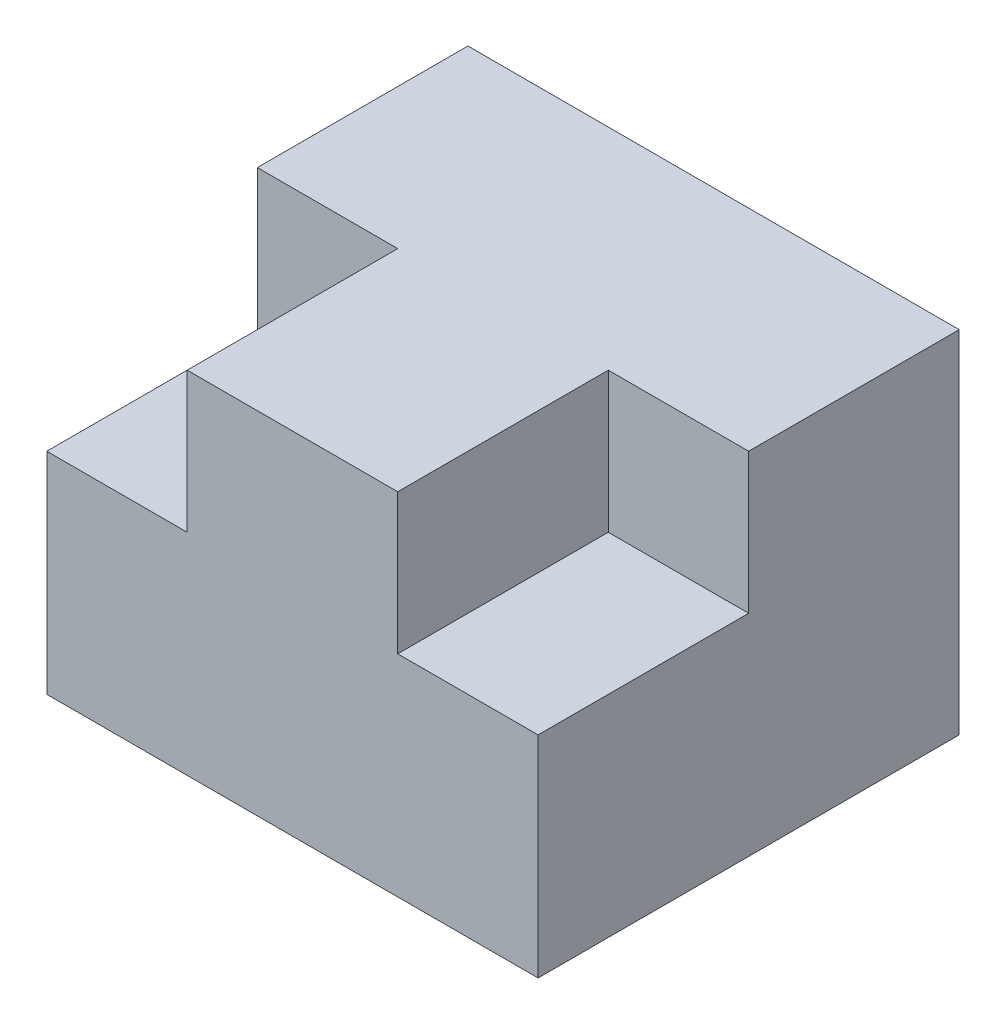
ISO-10303-21;
HEADER;
FILE_DESCRIPTION(('STEP AP214'),'2;1');
FILE_NAME('part.step','',(''),(''),'','','');
FILE_SCHEMA(('AUTOMOTIVE_DESIGN { 1 0 10303 214 1 1 1 1 }'));
ENDSEC;
DATA;
#1=APPLICATION_CONTEXT('core data for automotive mechanical design processes');
#2=APPLICATION_PROTOCOL_DEFINITION('international standard','automotive_design',2000,#1);
#3=PRODUCT_CONTEXT('',#1,'mechanical');
#4=PRODUCT('Part','Part','',(#3));
#5=PRODUCT_RELATED_PRODUCT_CATEGORY('part','',(#4));
#6=PRODUCT_DEFINITION_FORMATION('','',#4);
#7=PRODUCT_DEFINITION_CONTEXT('part definition',#1,'design');
#8=PRODUCT_DEFINITION('design','',#6,#7);
#9=PRODUCT_DEFINITION_SHAPE('','',#8);
#10=(LENGTH_UNIT() NAMED_UNIT(*) SI_UNIT(.MILLI.,.METRE.));
#11=(NAMED_UNIT(*) PLANE_ANGLE_UNIT() SI_UNIT($,.RADIAN.));
#12=(NAMED_UNIT(*) SI_UNIT($,.STERADIAN.) SOLID_ANGLE_UNIT());
#13=UNCERTAINTY_MEASURE_WITH_UNIT(LENGTH_MEASURE(1.E-05),#10,'distance_accuracy_value','');
#14=(GEOMETRIC_REPRESENTATION_CONTEXT(3) GLOBAL_UNCERTAINTY_ASSIGNED_CONTEXT((#13)) GLOBAL_UNIT_ASSIGNED_CONTEXT((#10,
#11,#12)) REPRESENTATION_CONTEXT('',''));
#15=CARTESIAN_POINT('',(0.,0.,0.));
#16=DIRECTION('',(0.,0.,1.));
#17=DIRECTION('',(1.,0.,0.));
#18=AXIS2_PLACEMENT_3D('',#15,#16,#17);
#19=CARTESIAN_POINT('',(0.,0.,15.));
#20=DIRECTION('',(0.,0.,1.));
#21=DIRECTION('',(1.,0.,0.));
#22=AXIS2_PLACEMENT_3D('',#19,#20,#21);
#23=PLANE('',#22);
#24=DIRECTION('',(-1.,0.,0.));
#25=VECTOR('',#24,1.);
#26=CARTESIAN_POINT('',(0.,15.,15.));
#27=LINE('',#26,#25);
#28=CARTESIAN_POINT('',(10.,15.,15.));
#29=VERTEX_POINT('',#28);
#30=CARTESIAN_POINT('',(0.,15.,15.));
#31=VERTEX_POINT('',#30);
#32=EDGE_CURVE('E143',#29,#31,#27,.T.);
#33=ORIENTED_EDGE('',*,*,#32,.F.);
#34=DIRECTION('',(0.,1.,0.));
#35=VECTOR('',#34,1.);
#36=CARTESIAN_POINT('',(10.,0.,15.));
#37=LINE('',#36,#35);
#38=CARTESIAN_POINT('',(10.,25.,15.));
#39=VERTEX_POINT('',#38);
#40=EDGE_CURVE('E107',#29,#39,#37,.T.);
#41=ORIENTED_EDGE('',*,*,#40,.T.);
#42=DIRECTION('',(1.,0.,0.));
#43=VECTOR('',#42,1.);
#44=CARTESIAN_POINT('',(0.,25.,15.));
#45=LINE('',#44,#43);
#46=CARTESIAN_POINT('',(0.,25.,15.));
#47=VERTEX_POINT('',#46);
#48=EDGE_CURVE('E126',#47,#39,#45,.T.);
#49=ORIENTED_EDGE('',*,*,#48,.F.);
#50=DIRECTION('',(0.,1.,0.));
#51=VECTOR('',#50,1.);
#52=CARTESIAN_POINT('',(0.,0.,15.));
#53=LINE('',#52,#51);
#54=EDGE_CURVE('E57',#31,#47,#53,.T.);
#55=ORIENTED_EDGE('',*,*,#54,.F.);
#56=EDGE_LOOP('',(#33,#41,#49,#55));
#57=FACE_BOUND('',#56,.T.);
#58=ADVANCED_FACE('F33',(#57),#23,.T.);
#59=CARTESIAN_POINT('',(35.,0.,15.));
#60=DIRECTION('',(-1.,0.,0.));
#61=DIRECTION('',(0.,0.,1.));
#62=AXIS2_PLACEMENT_3D('',#59,#60,#61);
#63=PLANE('',#62);
#64=DIRECTION('',(0.,1.,0.));
#65=VECTOR('',#64,1.);
#66=CARTESIAN_POINT('',(35.,0.,0.));
#67=LINE('',#66,#65);
#68=CARTESIAN_POINT('',(35.,0.,0.));
#69=VERTEX_POINT('',#68);
#70=CARTESIAN_POINT('',(35.,25.,0.));
#71=VERTEX_POINT('',#70);
#72=EDGE_CURVE('E96',#69,#71,#67,.T.);
#73=ORIENTED_EDGE('',*,*,#72,.T.);
#74=DIRECTION('',(0.,0.,-1.));
#75=VECTOR('',#74,1.);
#76=CARTESIAN_POINT('',(35.,25.,15.));
#77=LINE('',#76,#75);
#78=CARTESIAN_POINT('',(35.,25.,15.));
#79=VERTEX_POINT('',#78);
#80=EDGE_CURVE('E11',#79,#71,#77,.T.);
#81=ORIENTED_EDGE('',*,*,#80,.F.);
#82=DIRECTION('',(0.,1.,0.));
#83=VECTOR('',#82,1.);
#84=CARTESIAN_POINT('',(35.,0.,15.));
#85=LINE('',#84,#83);
#86=CARTESIAN_POINT('',(35.,15.,15.));
#87=VERTEX_POINT('',#86);
#88=EDGE_CURVE('E89',#87,#79,#85,.T.);
#89=ORIENTED_EDGE('',*,*,#88,.F.);
#90=DIRECTION('',(0.,0.,-1.));
#91=VECTOR('',#90,1.);
#92=CARTESIAN_POINT('',(35.,15.,30.));
#93=LINE('',#92,#91);
#94=CARTESIAN_POINT('',(35.,15.,30.));
#95=VERTEX_POINT('',#94);
#96=EDGE_CURVE('E48',#95,#87,#93,.T.);
#97=ORIENTED_EDGE('',*,*,#96,.F.);
#98=DIRECTION('',(0.,1.,0.));
#99=VECTOR('',#98,1.);
#100=CARTESIAN_POINT('',(35.,0.,30.));
#101=LINE('',#100,#99);
#102=CARTESIAN_POINT('',(35.,0.,30.));
#103=VERTEX_POINT('',#102);
#104=EDGE_CURVE('E98',#103,#95,#101,.T.);
#105=ORIENTED_EDGE('',*,*,#104,.F.);
#106=DIRECTION('',(0.,0.,-1.));
#107=VECTOR('',#106,1.);
#108=CARTESIAN_POINT('',(35.,0.,15.));
#109=LINE('',#108,#107);
#110=EDGE_CURVE('E82',#103,#69,#109,.T.);
#111=ORIENTED_EDGE('',*,*,#110,.T.);
#112=EDGE_LOOP('',(#73,#81,#89,#97,#105,#111));
#113=FACE_BOUND('',#112,.T.);
#114=ADVANCED_FACE('F35',(#113),#63,.F.);
#115=CARTESIAN_POINT('',(0.,25.,15.));
#116=DIRECTION('',(0.,1.,0.));
#117=DIRECTION('',(-1.,0.,0.));
#118=AXIS2_PLACEMENT_3D('',#115,#116,#117);
#119=PLANE('',#118);
#120=ORIENTED_EDGE('',*,*,#80,.T.);
#121=DIRECTION('',(1.,0.,0.));
#122=VECTOR('',#121,1.);
#123=CARTESIAN_POINT('',(0.,25.,0.));
#124=LINE('',#123,#122);
#125=CARTESIAN_POINT('',(0.,25.,0.));
#126=VERTEX_POINT('',#125);
#127=EDGE_CURVE('E102',#126,#71,#124,.T.);
#128=ORIENTED_EDGE('',*,*,#127,.F.);
#129=DIRECTION('',(0.,0.,-1.));
#130=VECTOR('',#129,1.);
#131=CARTESIAN_POINT('',(0.,25.,15.));
#132=LINE('',#131,#130);
#133=EDGE_CURVE('E41',#47,#126,#132,.T.);
#134=ORIENTED_EDGE('',*,*,#133,.F.);
#135=ORIENTED_EDGE('',*,*,#48,.T.);
#136=DIRECTION('',(0.,0.,-1.));
#137=VECTOR('',#136,1.);
#138=CARTESIAN_POINT('',(10.,25.,30.));
#139=LINE('',#138,#137);
#140=CARTESIAN_POINT('',(10.,25.,30.));
#141=VERTEX_POINT('',#140);
#142=EDGE_CURVE('E133',#141,#39,#139,.T.);
#143=ORIENTED_EDGE('',*,*,#142,.F.);
#144=DIRECTION('',(1.,0.,0.));
#145=VECTOR('',#144,1.);
#146=CARTESIAN_POINT('',(0.,25.,30.));
#147=LINE('',#146,#145);
#148=CARTESIAN_POINT('',(25.,25.,30.));
#149=VERTEX_POINT('',#148);
#150=EDGE_CURVE('E177',#141,#149,#147,.T.);
#151=ORIENTED_EDGE('',*,*,#150,.T.);
#152=DIRECTION('',(0.,0.,-1.));
#153=VECTOR('',#152,1.);
#154=CARTESIAN_POINT('',(25.,25.,30.));
#155=LINE('',#154,#153);
#156=CARTESIAN_POINT('',(25.,25.,15.));
#157=VERTEX_POINT('',#156);
#158=EDGE_CURVE('E151',#149,#157,#155,.T.);
#159=ORIENTED_EDGE('',*,*,#158,.T.);
#160=EDGE_CURVE('E120',#157,#79,#45,.T.);
#161=ORIENTED_EDGE('',*,*,#160,.T.);
#162=EDGE_LOOP('',(#120,#128,#134,#135,#143,#151,#159,#161));
#163=FACE_BOUND('',#162,.T.);
#164=ADVANCED_FACE('F117',(#163),#119,.T.);
#165=CARTESIAN_POINT('',(0.,0.,15.));
#166=DIRECTION('',(-1.,0.,0.));
#167=DIRECTION('',(0.,-1.,0.));
#168=AXIS2_PLACEMENT_3D('',#165,#166,#167);
#169=PLANE('',#168);
#170=ORIENTED_EDGE('',*,*,#133,.T.);
#171=DIRECTION('',(0.,1.,0.));
#172=VECTOR('',#171,1.);
#173=CARTESIAN_POINT('',(0.,0.,0.));
#174=LINE('',#173,#172);
#175=CARTESIAN_POINT('',(0.,0.,0.));
#176=VERTEX_POINT('',#175);
#177=EDGE_CURVE('E90',#176,#126,#174,.T.);
#178=ORIENTED_EDGE('',*,*,#177,.F.);
#179=DIRECTION('',(0.,0.,-1.));
#180=VECTOR('',#179,1.);
#181=CARTESIAN_POINT('',(0.,0.,15.));
#182=LINE('',#181,#180);
#183=CARTESIAN_POINT('',(0.,0.,30.));
#184=VERTEX_POINT('',#183);
#185=EDGE_CURVE('E85',#184,#176,#182,.T.);
#186=ORIENTED_EDGE('',*,*,#185,.F.);
#187=DIRECTION('',(0.,1.,0.));
#188=VECTOR('',#187,1.);
#189=CARTESIAN_POINT('',(0.,0.,30.));
#190=LINE('',#189,#188);
#191=CARTESIAN_POINT('',(0.,15.,30.));
#192=VERTEX_POINT('',#191);
#193=EDGE_CURVE('E168',#184,#192,#190,.T.);
#194=ORIENTED_EDGE('',*,*,#193,.T.);
#195=DIRECTION('',(0.,0.,-1.));
#196=VECTOR('',#195,1.);
#197=CARTESIAN_POINT('',(0.,15.,30.));
#198=LINE('',#197,#196);
#199=EDGE_CURVE('E156',#192,#31,#198,.T.);
#200=ORIENTED_EDGE('',*,*,#199,.T.);
#201=ORIENTED_EDGE('',*,*,#54,.T.);
#202=EDGE_LOOP('',(#170,#178,#186,#194,#200,#201));
#203=FACE_BOUND('',#202,.T.);
#204=ADVANCED_FACE('F113',(#203),#169,.T.);
#205=CARTESIAN_POINT('',(0.,0.,15.));
#206=DIRECTION('',(0.,1.,0.));
#207=DIRECTION('',(0.,0.,1.));
#208=AXIS2_PLACEMENT_3D('',#205,#206,#207);
#209=PLANE('',#208);
#210=DIRECTION('',(1.,0.,0.));
#211=VECTOR('',#210,1.);
#212=CARTESIAN_POINT('',(0.,0.,0.));
#213=LINE('',#212,#211);
#214=EDGE_CURVE('E77',#176,#69,#213,.T.);
#215=ORIENTED_EDGE('',*,*,#214,.T.);
#216=ORIENTED_EDGE('',*,*,#110,.F.);
#217=DIRECTION('',(1.,0.,0.));
#218=VECTOR('',#217,1.);
#219=CARTESIAN_POINT('',(0.,0.,30.));
#220=LINE('',#219,#218);
#221=EDGE_CURVE('E166',#184,#103,#220,.T.);
#222=ORIENTED_EDGE('',*,*,#221,.F.);
#223=ORIENTED_EDGE('',*,*,#185,.T.);
#224=EDGE_LOOP('',(#215,#216,#222,#223));
#225=FACE_BOUND('',#224,.T.);
#226=ADVANCED_FACE('F79',(#225),#209,.F.);
#227=DIRECTION('',(0.,1.,0.));
#228=VECTOR('',#227,1.);
#229=CARTESIAN_POINT('',(25.,0.,15.));
#230=LINE('',#229,#228);
#231=CARTESIAN_POINT('',(25.,15.,15.));
#232=VERTEX_POINT('',#231);
#233=EDGE_CURVE('E103',#232,#157,#230,.T.);
#234=ORIENTED_EDGE('',*,*,#233,.F.);
#235=DIRECTION('',(1.,0.,0.));
#236=VECTOR('',#235,1.);
#237=CARTESIAN_POINT('',(0.,15.,15.));
#238=LINE('',#237,#236);
#239=EDGE_CURVE('E147',#232,#87,#238,.T.);
#240=ORIENTED_EDGE('',*,*,#239,.T.);
#241=ORIENTED_EDGE('',*,*,#88,.T.);
#242=ORIENTED_EDGE('',*,*,#160,.F.);
#243=EDGE_LOOP('',(#234,#240,#241,#242));
#244=FACE_BOUND('',#243,.T.);
#245=ADVANCED_FACE('F195',(#244),#23,.T.);
#246=CARTESIAN_POINT('',(0.,0.,0.));
#247=DIRECTION('',(0.,0.,1.));
#248=DIRECTION('',(1.,0.,0.));
#249=AXIS2_PLACEMENT_3D('',#246,#247,#248);
#250=PLANE('',#249);
#251=ORIENTED_EDGE('',*,*,#127,.T.);
#252=ORIENTED_EDGE('',*,*,#72,.F.);
#253=ORIENTED_EDGE('',*,*,#214,.F.);
#254=ORIENTED_EDGE('',*,*,#177,.T.);
#255=EDGE_LOOP('',(#251,#252,#253,#254));
#256=FACE_BOUND('',#255,.T.);
#257=ADVANCED_FACE('F100',(#256),#250,.F.);
#258=CARTESIAN_POINT('',(25.,0.,30.));
#259=DIRECTION('',(1.,0.,0.));
#260=DIRECTION('',(0.,0.,-1.));
#261=AXIS2_PLACEMENT_3D('',#258,#259,#260);
#262=PLANE('',#261);
#263=DIRECTION('',(0.,0.,-1.));
#264=VECTOR('',#263,1.);
#265=CARTESIAN_POINT('',(25.,15.,30.));
#266=LINE('',#265,#264);
#267=CARTESIAN_POINT('',(25.,15.,30.));
#268=VERTEX_POINT('',#267);
#269=EDGE_CURVE('E159',#268,#232,#266,.T.);
#270=ORIENTED_EDGE('',*,*,#269,.T.);
#271=ORIENTED_EDGE('',*,*,#233,.T.);
#272=ORIENTED_EDGE('',*,*,#158,.F.);
#273=DIRECTION('',(0.,-1.,0.));
#274=VECTOR('',#273,1.);
#275=CARTESIAN_POINT('',(25.,0.,30.));
#276=LINE('',#275,#274);
#277=EDGE_CURVE('E179',#149,#268,#276,.T.);
#278=ORIENTED_EDGE('',*,*,#277,.T.);
#279=EDGE_LOOP('',(#270,#271,#272,#278));
#280=FACE_BOUND('',#279,.T.);
#281=ADVANCED_FACE('F185',(#280),#262,.T.);
#282=CARTESIAN_POINT('',(10.,0.,30.));
#283=DIRECTION('',(1.,0.,0.));
#284=DIRECTION('',(0.,1.,0.));
#285=AXIS2_PLACEMENT_3D('',#282,#283,#284);
#286=PLANE('',#285);
#287=ORIENTED_EDGE('',*,*,#40,.F.);
#288=DIRECTION('',(0.,0.,-1.));
#289=VECTOR('',#288,1.);
#290=CARTESIAN_POINT('',(10.,15.,30.));
#291=LINE('',#290,#289);
#292=CARTESIAN_POINT('',(10.,15.,30.));
#293=VERTEX_POINT('',#292);
#294=EDGE_CURVE('E154',#293,#29,#291,.T.);
#295=ORIENTED_EDGE('',*,*,#294,.F.);
#296=DIRECTION('',(0.,-1.,0.));
#297=VECTOR('',#296,1.);
#298=CARTESIAN_POINT('',(10.,0.,30.));
#299=LINE('',#298,#297);
#300=EDGE_CURVE('E174',#141,#293,#299,.T.);
#301=ORIENTED_EDGE('',*,*,#300,.F.);
#302=ORIENTED_EDGE('',*,*,#142,.T.);
#303=EDGE_LOOP('',(#287,#295,#301,#302));
#304=FACE_BOUND('',#303,.T.);
#305=ADVANCED_FACE('F211',(#304),#286,.F.);
#306=CARTESIAN_POINT('',(0.,15.,30.));
#307=DIRECTION('',(0.,1.,0.));
#308=DIRECTION('',(-1.,0.,0.));
#309=AXIS2_PLACEMENT_3D('',#306,#307,#308);
#310=PLANE('',#309);
#311=ORIENTED_EDGE('',*,*,#294,.T.);
#312=ORIENTED_EDGE('',*,*,#32,.T.);
#313=ORIENTED_EDGE('',*,*,#199,.F.);
#314=DIRECTION('',(1.,0.,0.));
#315=VECTOR('',#314,1.);
#316=CARTESIAN_POINT('',(0.,15.,30.));
#317=LINE('',#316,#315);
#318=EDGE_CURVE('E171',#192,#293,#317,.T.);
#319=ORIENTED_EDGE('',*,*,#318,.T.);
#320=EDGE_LOOP('',(#311,#312,#313,#319));
#321=FACE_BOUND('',#320,.T.);
#322=ADVANCED_FACE('F213',(#321),#310,.T.);
#323=CARTESIAN_POINT('',(0.,15.,30.));
#324=DIRECTION('',(0.,-1.,0.));
#325=DIRECTION('',(0.,0.,-1.));
#326=AXIS2_PLACEMENT_3D('',#323,#324,#325);
#327=PLANE('',#326);
#328=ORIENTED_EDGE('',*,*,#239,.F.);
#329=ORIENTED_EDGE('',*,*,#269,.F.);
#330=DIRECTION('',(-1.,0.,0.));
#331=VECTOR('',#330,1.);
#332=CARTESIAN_POINT('',(0.,15.,30.));
#333=LINE('',#332,#331);
#334=EDGE_CURVE('E162',#95,#268,#333,.T.);
#335=ORIENTED_EDGE('',*,*,#334,.F.);
#336=ORIENTED_EDGE('',*,*,#96,.T.);
#337=EDGE_LOOP('',(#328,#329,#335,#336));
#338=FACE_BOUND('',#337,.T.);
#339=ADVANCED_FACE('F215',(#338),#327,.F.);
#340=CARTESIAN_POINT('',(0.,0.,30.));
#341=DIRECTION('',(0.,0.,1.));
#342=DIRECTION('',(1.,0.,0.));
#343=AXIS2_PLACEMENT_3D('',#340,#341,#342);
#344=PLANE('',#343);
#345=ORIENTED_EDGE('',*,*,#277,.F.);
#346=ORIENTED_EDGE('',*,*,#150,.F.);
#347=ORIENTED_EDGE('',*,*,#300,.T.);
#348=ORIENTED_EDGE('',*,*,#318,.F.);
#349=ORIENTED_EDGE('',*,*,#193,.F.);
#350=ORIENTED_EDGE('',*,*,#221,.T.);
#351=ORIENTED_EDGE('',*,*,#104,.T.);
#352=ORIENTED_EDGE('',*,*,#334,.T.);
#353=EDGE_LOOP('',(#345,#346,#347,#348,#349,#350,#351,#352));
#354=FACE_BOUND('',#353,.T.);
#355=ADVANCED_FACE('F193',(#354),#344,.T.);
#356=CLOSED_SHELL('',(#58,#114,#164,#204,#226,#245,#257,#281,#305,#322,#339,#355));
#357=MANIFOLD_SOLID_BREP('B2',#356);
#358=ADVANCED_BREP_SHAPE_REPRESENTATION('',(#18,#357),#14);
#359=SHAPE_DEFINITION_REPRESENTATION(#9,#358);
ENDSEC;
END-ISO-10303-21;
